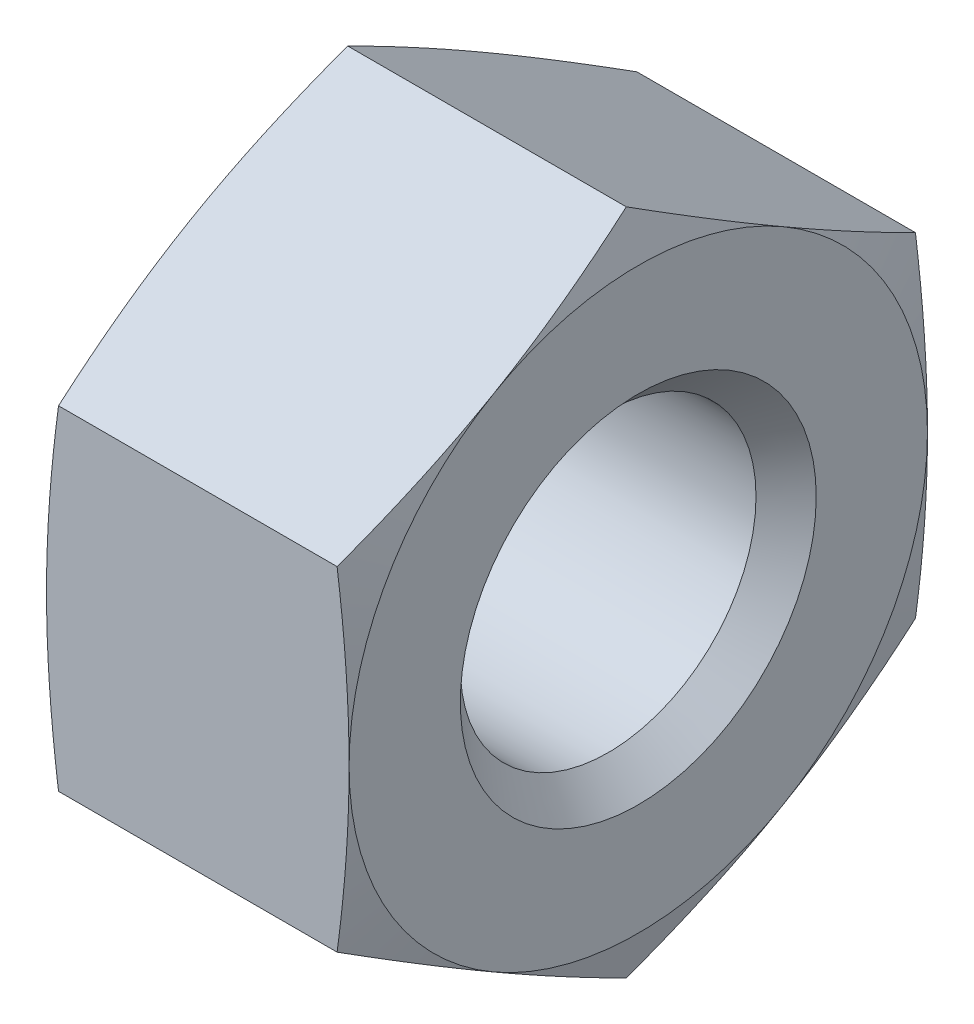
ISO-10303-21;
HEADER;
FILE_DESCRIPTION(('STEP AP214'),'2;1');
FILE_NAME('part.step','',(''),(''),'','','');
FILE_SCHEMA(('AUTOMOTIVE_DESIGN { 1 0 10303 214 1 1 1 1 }'));
ENDSEC;
DATA;
#1=APPLICATION_CONTEXT('core data for automotive mechanical design processes');
#2=APPLICATION_PROTOCOL_DEFINITION('international standard','automotive_design',2000,#1);
#3=PRODUCT_CONTEXT('',#1,'mechanical');
#4=PRODUCT('Part','Part','',(#3));
#5=PRODUCT_RELATED_PRODUCT_CATEGORY('part','',(#4));
#6=PRODUCT_DEFINITION_FORMATION('','',#4);
#7=PRODUCT_DEFINITION_CONTEXT('part definition',#1,'design');
#8=PRODUCT_DEFINITION('design','',#6,#7);
#9=PRODUCT_DEFINITION_SHAPE('','',#8);
#10=(LENGTH_UNIT() NAMED_UNIT(*) SI_UNIT(.MILLI.,.METRE.));
#11=(NAMED_UNIT(*) PLANE_ANGLE_UNIT() SI_UNIT($,.RADIAN.));
#12=(NAMED_UNIT(*) SI_UNIT($,.STERADIAN.) SOLID_ANGLE_UNIT());
#13=UNCERTAINTY_MEASURE_WITH_UNIT(LENGTH_MEASURE(1.E-05),#10,'distance_accuracy_value','');
#14=(GEOMETRIC_REPRESENTATION_CONTEXT(3) GLOBAL_UNCERTAINTY_ASSIGNED_CONTEXT((#13)) GLOBAL_UNIT_ASSIGNED_CONTEXT((#10,
#11,#12)) REPRESENTATION_CONTEXT('',''));
#15=CARTESIAN_POINT('',(0.,0.,0.));
#16=DIRECTION('',(0.,0.,1.));
#17=DIRECTION('',(1.,0.,0.));
#18=AXIS2_PLACEMENT_3D('',#15,#16,#17);
#19=CARTESIAN_POINT('',(3.39999999999999,0.,0.));
#20=DIRECTION('',(-1.,0.,0.));
#21=DIRECTION('',(0.,0.,1.));
#22=AXIS2_PLACEMENT_3D('',#19,#20,#21);
#23=CONICAL_SURFACE('',#22,19.1889727457342,1.30899693899575);
#24=CARTESIAN_POINT('',(5.34021947172718,-10.0251737628938,6.5));
#25=CARTESIAN_POINT('',(5.40678083004104,-9.72904060210872,6.5));
#26=CARTESIAN_POINT('',(5.47254405614128,-9.43272483546303,6.5));
#27=CARTESIAN_POINT('',(5.60204302842791,-8.83963813738695,6.5));
#28=CARTESIAN_POINT('',(5.66577868976473,-8.54286718745137,6.5));
#29=CARTESIAN_POINT('',(5.79084276931192,-7.94853361191854,6.5));
#30=CARTESIAN_POINT('',(5.85216893566304,-7.65097051080964,6.5));
#31=CARTESIAN_POINT('',(5.97176826112497,-7.05523170332754,6.5));
#32=CARTESIAN_POINT('',(6.03004144512884,-6.75705600196991,6.5));
#33=CARTESIAN_POINT('',(6.14231404260078,-6.16258492215604,6.5));
#34=CARTESIAN_POINT('',(6.19634623812122,-5.86629576492101,6.5));
#35=CARTESIAN_POINT('',(6.29980000329597,-5.27291497483705,6.5));
#36=CARTESIAN_POINT('',(6.34922167184055,-4.97582335934059,6.5));
#37=CARTESIAN_POINT('',(6.44236363249609,-4.3807637050931,6.5));
#38=CARTESIAN_POINT('',(6.48608436687417,-4.08279573616388,6.5));
#39=CARTESIAN_POINT('',(6.56655383876985,-3.48590898138837,6.5));
#40=CARTESIAN_POINT('',(6.60330256494201,-3.18699019399563,6.5));
#41=CARTESIAN_POINT('',(6.66881272585104,-2.584764246691,6.5));
#42=CARTESIAN_POINT('',(6.69747679536173,-2.28144633745983,6.5));
#43=CARTESIAN_POINT('',(6.74485048441128,-1.67402738577586,6.5));
#44=CARTESIAN_POINT('',(6.76356033446228,-1.36992636162173,6.5));
#45=CARTESIAN_POINT('',(6.78993598979016,-0.761394180131323,6.5));
#46=CARTESIAN_POINT('',(6.7976075268627,-0.456963276338684,6.5));
#47=CARTESIAN_POINT('',(6.80143396768605,0.151971860939782,6.5));
#48=CARTESIAN_POINT('',(6.7975888925574,0.456476094290104,6.5));
#49=CARTESIAN_POINT('',(6.77859056790397,1.06644588047543,6.5));
#50=CARTESIAN_POINT('',(6.76338836233449,1.37190987722144,6.5));
#51=CARTESIAN_POINT('',(6.72254386379028,1.9821326299433,6.5));
#52=CARTESIAN_POINT('',(6.69690133338368,2.28689136972182,6.5));
#53=CARTESIAN_POINT('',(6.63649559256864,2.89571025617504,6.5));
#54=CARTESIAN_POINT('',(6.60172585056413,3.19976974462881,6.5));
#55=CARTESIAN_POINT('',(6.52454313303007,3.80690394091179,6.5));
#56=CARTESIAN_POINT('',(6.48213017110956,4.10997865049346,6.5));
#57=CARTESIAN_POINT('',(6.3850484057838,4.75506655947626,6.5));
#58=CARTESIAN_POINT('',(6.32950103221924,5.09694645911478,6.5));
#59=CARTESIAN_POINT('',(6.21211981028681,5.77963160417396,6.5));
#60=CARTESIAN_POINT('',(6.15028565402791,6.12043679611797,6.5));
#61=CARTESIAN_POINT('',(6.02169857330525,6.80116950978304,6.5));
#62=CARTESIAN_POINT('',(5.95494485464203,7.14109688058279,6.5));
#63=CARTESIAN_POINT('',(5.81759232013227,7.82017640279045,6.5));
#64=CARTESIAN_POINT('',(5.74699343661706,8.15932854044599,6.5));
#65=CARTESIAN_POINT('',(5.60273764386895,8.83712554010565,6.5));
#66=CARTESIAN_POINT('',(5.52907948902662,9.17577013614967,6.5));
#67=CARTESIAN_POINT('',(5.37934752234481,9.85252567713227,6.5));
#68=CARTESIAN_POINT('',(5.30327369437395,10.1906366184914,6.5));
#69=CARTESIAN_POINT('',(5.07216770023523,11.2043244352433,6.5));
#70=CARTESIAN_POINT('',(4.91425365308442,11.8792441339056,6.5));
#71=CARTESIAN_POINT('',(4.67466611827668,12.8860888383443,6.5));
#72=CARTESIAN_POINT('',(4.59491764348655,13.2184762862448,6.5));
#73=CARTESIAN_POINT('',(4.43437664170439,13.8829947724658,6.5));
#74=CARTESIAN_POINT('',(4.3535841283887,14.2151258140848,6.5));
#75=CARTESIAN_POINT('',(4.10990177296983,15.211225435673,6.5));
#76=CARTESIAN_POINT('',(3.94571296506591,15.8748760485654,6.5));
#77=CARTESIAN_POINT('',(3.61515188527192,17.2004164720309,6.5));
#78=CARTESIAN_POINT('',(3.44878386547827,17.8623073457779,6.5));
#79=CARTESIAN_POINT('',(3.1141911912607,19.1855890197424,6.5));
#80=CARTESIAN_POINT('',(2.94596661870469,19.8469798406471,6.5));
#81=CARTESIAN_POINT('',(2.77710817478578,20.5082072209263,6.5));
#82=B_SPLINE_CURVE_WITH_KNOTS('',3,(#24,#25,#26,#27,#28,#29,#30,#31,#32,#33,#34,#35,#36,#37,#38,
#39,#40,#41,#42,#43,#44,#45,#46,#47,#48,#49,#50,#51,#52,#53,#54,#55,#56,#57,#58,#59,#60,#61,#62,
#63,#64,#65,#66,#67,#68,#69,#70,#71,#72,#73,#74,#75,#76,#77,#78,#79,#80,#81),.UNSPECIFIED.,.F.,
.F.,(4,2,2,2,2,2,2,2,2,2,2,2,2,2,2,2,2,2,2,2,2,2,2,2,2,2,2,2,4),(0.,0.910567903118991,
1.82117386170785,2.73261153485089,3.64404177526483,4.54753951194927,5.45101786523108,
6.3544260867088,7.2578357782774,8.17170128302531,9.08554562425924,9.99891526780276,
10.9122832363018,11.8296112516783,12.7469601299185,13.6649672775899,14.5829727907324,
15.6219850852705,16.6610482892823,17.7002796055642,18.7395292165465,19.779206196932,
20.8188901215308,22.8982953187992,23.9237562808119,24.9492038234374,27.0001743679401,
29.0476091835823,31.0949540719542),.UNSPECIFIED.);
#83=CARTESIAN_POINT('',(6.53056275187202,-3.75277674973257,6.5));
#84=VERTEX_POINT('',#83);
#85=CARTESIAN_POINT('',(6.8,0.,6.5));
#86=VERTEX_POINT('',#85);
#87=EDGE_CURVE('E542',#84,#86,#82,.T.);
#88=ORIENTED_EDGE('',*,*,#87,.F.);
#89=CARTESIAN_POINT('',(6.53053181105035,-7.50566896951898,-0.000199999999999112));
#90=CARTESIAN_POINT('',(6.57231021310497,-7.34981601048003,0.269745243565409));
#91=CARTESIAN_POINT('',(6.61023811897147,-7.19368047083108,0.540179931104566));
#92=CARTESIAN_POINT('',(6.67687390648081,-6.88085798289523,1.08200437395956));
#93=CARTESIAN_POINT('',(6.70557804307257,-6.72417083668118,1.35339447209528));
#94=CARTESIAN_POINT('',(6.75209055272491,-6.41119513752199,1.89548428457339));
#95=CARTESIAN_POINT('',(6.76995439432567,-6.25490870095099,2.16618033324825));
#96=CARTESIAN_POINT('',(6.7939079789398,-5.94213652150166,2.70791763924853));
#97=CARTESIAN_POINT('',(6.79999999999999,-5.78565082305026,2.97895881962427));
#98=CARTESIAN_POINT('',(6.79999999999999,-5.47267942614745,3.52104118037574));
#99=CARTESIAN_POINT('',(6.7939079789398,-5.31619372769604,3.79208236075147));
#100=CARTESIAN_POINT('',(6.76995439432568,-5.00342154824672,4.33381966675176));
#101=CARTESIAN_POINT('',(6.75209055272491,-4.84713511167572,4.60451571542661));
#102=CARTESIAN_POINT('',(6.70557804307257,-4.53415941251653,5.14660552790472));
#103=CARTESIAN_POINT('',(6.67687390648081,-4.37747226630247,5.41799562604044));
#104=CARTESIAN_POINT('',(6.61023811897147,-4.06464977836662,5.95982006889544));
#105=CARTESIAN_POINT('',(6.57231021310498,-3.90851423871768,6.23025475643459));
#106=CARTESIAN_POINT('',(6.53053181105035,-3.75266127967873,6.5002));
#107=B_SPLINE_CURVE_WITH_KNOTS('',3,(#89,#90,#91,#92,#93,#94,#95,#96,#97,#98,#99,#100,#101,#102,
#103,#104,#105,#106),.UNSPECIFIED.,.F.,.F.,(4,2,2,2,2,2,2,2,4),(0.,0.943529232034515,
1.88744107483688,2.82648138276556,3.76533995226988,4.70419852177419,5.64323882970288,
6.58715067250524,7.53067990453976),.UNSPECIFIED.);
#108=CARTESIAN_POINT('',(6.79999999999999,-5.62916512459885,3.25));
#109=VERTEX_POINT('',#108);
#110=EDGE_CURVE('E190',#109,#84,#107,.T.);
#111=ORIENTED_EDGE('',*,*,#110,.F.);
#112=CARTESIAN_POINT('',(6.79999999999999,0.,0.));
#113=DIRECTION('',(1.,0.,0.));
#114=DIRECTION('',(0.,0.,-1.));
#115=AXIS2_PLACEMENT_3D('',#112,#113,#114);
#116=CIRCLE('',#115,6.5);
#117=EDGE_CURVE('E570',#86,#109,#116,.T.);
#118=ORIENTED_EDGE('',*,*,#117,.F.);
#119=EDGE_LOOP('',(#88,#111,#118));
#120=FACE_BOUND('',#119,.T.);
#121=ADVANCED_FACE('F83',(#120),#23,.T.);
#122=CARTESIAN_POINT('',(6.53056275187202,3.75277674973257,6.5));
#123=VERTEX_POINT('',#122);
#124=EDGE_CURVE('E264',#86,#123,#82,.T.);
#125=ORIENTED_EDGE('',*,*,#124,.F.);
#126=CARTESIAN_POINT('',(6.79999999999999,5.62916512459885,3.25000000000001));
#127=VERTEX_POINT('',#126);
#128=EDGE_CURVE('E336',#127,#86,#116,.T.);
#129=ORIENTED_EDGE('',*,*,#128,.F.);
#130=CARTESIAN_POINT('',(6.53053181105036,3.75266127967873,6.5002));
#131=CARTESIAN_POINT('',(6.57231021310498,3.90851423871768,6.23025475643459));
#132=CARTESIAN_POINT('',(6.61023811897147,4.06464977836662,5.95982006889543));
#133=CARTESIAN_POINT('',(6.67687390648081,4.37747226630248,5.41799562604044));
#134=CARTESIAN_POINT('',(6.70557804307257,4.53415941251653,5.14660552790472));
#135=CARTESIAN_POINT('',(6.75209055272491,4.84713511167573,4.60451571542661));
#136=CARTESIAN_POINT('',(6.76995439432567,5.00342154824672,4.33381966675175));
#137=CARTESIAN_POINT('',(6.7939079789398,5.31619372769605,3.79208236075147));
#138=CARTESIAN_POINT('',(6.79999999999999,5.47267942614746,3.52104118037574));
#139=CARTESIAN_POINT('',(6.79999999999999,5.78565082305027,2.97895881962426));
#140=CARTESIAN_POINT('',(6.7939079789398,5.94213652150167,2.70791763924853));
#141=CARTESIAN_POINT('',(6.76995439432567,6.254908700951,2.16618033324825));
#142=CARTESIAN_POINT('',(6.75209055272491,6.41119513752199,1.89548428457339));
#143=CARTESIAN_POINT('',(6.70557804307257,6.72417083668119,1.35339447209528));
#144=CARTESIAN_POINT('',(6.6768739064808,6.88085798289524,1.08200437395956));
#145=CARTESIAN_POINT('',(6.61023811897147,7.1936804708311,0.540179931104566));
#146=CARTESIAN_POINT('',(6.57231021310497,7.34981601048004,0.269745243565409));
#147=CARTESIAN_POINT('',(6.53053181105035,7.50566896951899,-0.000199999999999644));
#148=B_SPLINE_CURVE_WITH_KNOTS('',3,(#130,#131,#132,#133,#134,#135,#136,#137,#138,#139,#140,
#141,#142,#143,#144,#145,#146,#147),.UNSPECIFIED.,.F.,.F.,(4,2,2,2,2,2,2,2,4),(0.,
0.943529232034517,1.88744107483688,2.82648138276556,3.76533995226988,4.7041985217742,
5.64323882970288,6.58715067250524,7.53067990453976),.UNSPECIFIED.);
#149=EDGE_CURVE('E262',#123,#127,#148,.T.);
#150=ORIENTED_EDGE('',*,*,#149,.F.);
#151=EDGE_LOOP('',(#125,#129,#150));
#152=FACE_BOUND('',#151,.T.);
#153=ADVANCED_FACE('F236',(#152),#23,.T.);
#154=CARTESIAN_POINT('',(6.53056275187202,7.50555349946515,0.));
#155=VERTEX_POINT('',#154);
#156=EDGE_CURVE('E257',#127,#155,#148,.T.);
#157=ORIENTED_EDGE('',*,*,#156,.F.);
#158=CARTESIAN_POINT('',(6.79999999999999,5.62916512459885,-3.25000000000002));
#159=VERTEX_POINT('',#158);
#160=EDGE_CURVE('E332',#159,#127,#116,.T.);
#161=ORIENTED_EDGE('',*,*,#160,.F.);
#162=CARTESIAN_POINT('',(6.53053181105035,7.50566896951899,0.000199999999999112));
#163=CARTESIAN_POINT('',(6.57231021310497,7.34981601048004,-0.269745243565409));
#164=CARTESIAN_POINT('',(6.61023811897147,7.1936804708311,-0.540179931104566));
#165=CARTESIAN_POINT('',(6.6768739064808,6.88085798289525,-1.08200437395956));
#166=CARTESIAN_POINT('',(6.70557804307257,6.72417083668119,-1.35339447209528));
#167=CARTESIAN_POINT('',(6.75209055272491,6.41119513752199,-1.89548428457339));
#168=CARTESIAN_POINT('',(6.76995439432567,6.254908700951,-2.16618033324825));
#169=CARTESIAN_POINT('',(6.7939079789398,5.94213652150167,-2.70791763924853));
#170=CARTESIAN_POINT('',(6.79999999999999,5.78565082305027,-2.97895881962427));
#171=CARTESIAN_POINT('',(6.79999999999999,5.47267942614746,-3.52104118037574));
#172=CARTESIAN_POINT('',(6.7939079789398,5.31619372769605,-3.79208236075147));
#173=CARTESIAN_POINT('',(6.76995439432567,5.00342154824672,-4.33381966675176));
#174=CARTESIAN_POINT('',(6.75209055272491,4.84713511167573,-4.60451571542661));
#175=CARTESIAN_POINT('',(6.70557804307257,4.53415941251653,-5.14660552790472));
#176=CARTESIAN_POINT('',(6.67687390648081,4.37747226630248,-5.41799562604044));
#177=CARTESIAN_POINT('',(6.61023811897147,4.06464977836662,-5.95982006889544));
#178=CARTESIAN_POINT('',(6.57231021310497,3.90851423871768,-6.23025475643459));
#179=CARTESIAN_POINT('',(6.53053181105035,3.75266127967873,-6.5002));
#180=B_SPLINE_CURVE_WITH_KNOTS('',3,(#162,#163,#164,#165,#166,#167,#168,#169,#170,#171,#172,
#173,#174,#175,#176,#177,#178,#179),.UNSPECIFIED.,.F.,.F.,(4,2,2,2,2,2,2,2,4),(0.,
0.943529232034517,1.88744107483688,2.82648138276556,3.76533995226988,4.7041985217742,
5.64323882970288,6.58715067250524,7.53067990453976),.UNSPECIFIED.);
#181=EDGE_CURVE('E263',#155,#159,#180,.T.);
#182=ORIENTED_EDGE('',*,*,#181,.F.);
#183=EDGE_LOOP('',(#157,#161,#182));
#184=FACE_BOUND('',#183,.T.);
#185=ADVANCED_FACE('F417',(#184),#23,.T.);
#186=CARTESIAN_POINT('',(6.53056275187202,3.75277674973257,-6.5));
#187=VERTEX_POINT('',#186);
#188=EDGE_CURVE('E252',#159,#187,#180,.T.);
#189=ORIENTED_EDGE('',*,*,#188,.F.);
#190=CARTESIAN_POINT('',(6.79999999999999,0.,-6.5));
#191=VERTEX_POINT('',#190);
#192=EDGE_CURVE('E323',#191,#159,#116,.T.);
#193=ORIENTED_EDGE('',*,*,#192,.F.);
#194=CARTESIAN_POINT('',(5.34021947172718,-10.0251737628938,-6.5));
#195=CARTESIAN_POINT('',(5.40678083004104,-9.72904060210872,-6.5));
#196=CARTESIAN_POINT('',(5.47254405614128,-9.43272483546303,-6.5));
#197=CARTESIAN_POINT('',(5.60204302842791,-8.83963813738695,-6.5));
#198=CARTESIAN_POINT('',(5.66577868976473,-8.54286718745137,-6.5));
#199=CARTESIAN_POINT('',(5.79084276931192,-7.94853361191854,-6.5));
#200=CARTESIAN_POINT('',(5.85216893566304,-7.65097051080964,-6.5));
#201=CARTESIAN_POINT('',(5.97176826112497,-7.05523170332754,-6.5));
#202=CARTESIAN_POINT('',(6.03004144512884,-6.75705600196991,-6.5));
#203=CARTESIAN_POINT('',(6.14231404260078,-6.16258492215604,-6.5));
#204=CARTESIAN_POINT('',(6.19634623812122,-5.86629576492101,-6.5));
#205=CARTESIAN_POINT('',(6.29980000329597,-5.27291497483705,-6.5));
#206=CARTESIAN_POINT('',(6.34922167184055,-4.97582335934059,-6.5));
#207=CARTESIAN_POINT('',(6.44236363249609,-4.3807637050931,-6.5));
#208=CARTESIAN_POINT('',(6.48608436687417,-4.08279573616388,-6.5));
#209=CARTESIAN_POINT('',(6.56655383876985,-3.48590898138837,-6.5));
#210=CARTESIAN_POINT('',(6.60330256494201,-3.18699019399563,-6.5));
#211=CARTESIAN_POINT('',(6.66881272585104,-2.584764246691,-6.5));
#212=CARTESIAN_POINT('',(6.69747679536173,-2.28144633745983,-6.5));
#213=CARTESIAN_POINT('',(6.74485048441128,-1.67402738577586,-6.5));
#214=CARTESIAN_POINT('',(6.76356033446228,-1.36992636162173,-6.5));
#215=CARTESIAN_POINT('',(6.78993598979016,-0.761394180131322,-6.5));
#216=CARTESIAN_POINT('',(6.7976075268627,-0.456963276338684,-6.5));
#217=CARTESIAN_POINT('',(6.80143396768605,0.151971860939783,-6.5));
#218=CARTESIAN_POINT('',(6.79758889255739,0.456476094290105,-6.5));
#219=CARTESIAN_POINT('',(6.77859056790397,1.06644588047543,-6.5));
#220=CARTESIAN_POINT('',(6.76338836233449,1.37190987722144,-6.5));
#221=CARTESIAN_POINT('',(6.72254386379028,1.9821326299433,-6.5));
#222=CARTESIAN_POINT('',(6.69690133338368,2.28689136972182,-6.5));
#223=CARTESIAN_POINT('',(6.63649559256864,2.89571025617504,-6.5));
#224=CARTESIAN_POINT('',(6.60172585056413,3.19976974462881,-6.5));
#225=CARTESIAN_POINT('',(6.52454313303007,3.8069039409118,-6.5));
#226=CARTESIAN_POINT('',(6.48213017110956,4.10997865049346,-6.5));
#227=CARTESIAN_POINT('',(6.3850484057838,4.75506655947626,-6.5));
#228=CARTESIAN_POINT('',(6.32950103221924,5.09694645911478,-6.5));
#229=CARTESIAN_POINT('',(6.21211981028681,5.77963160417396,-6.5));
#230=CARTESIAN_POINT('',(6.1502856540279,6.12043679611797,-6.5));
#231=CARTESIAN_POINT('',(6.02169857330525,6.80116950978304,-6.5));
#232=CARTESIAN_POINT('',(5.95494485464203,7.14109688058279,-6.5));
#233=CARTESIAN_POINT('',(5.81759232013227,7.82017640279045,-6.5));
#234=CARTESIAN_POINT('',(5.74699343661706,8.15932854044599,-6.5));
#235=CARTESIAN_POINT('',(5.60273764386895,8.83712554010565,-6.5));
#236=CARTESIAN_POINT('',(5.52907948902662,9.17577013614967,-6.5));
#237=CARTESIAN_POINT('',(5.3793475223448,9.85252567713227,-6.5));
#238=CARTESIAN_POINT('',(5.30327369437395,10.1906366184914,-6.5));
#239=CARTESIAN_POINT('',(5.07216770023522,11.2043244352433,-6.5));
#240=CARTESIAN_POINT('',(4.91425365308442,11.8792441339056,-6.5));
#241=CARTESIAN_POINT('',(4.67466611827667,12.8860888383443,-6.5));
#242=CARTESIAN_POINT('',(4.59491764348654,13.2184762862448,-6.5));
#243=CARTESIAN_POINT('',(4.43437664170439,13.8829947724658,-6.5));
#244=CARTESIAN_POINT('',(4.3535841283887,14.2151258140848,-6.5));
#245=CARTESIAN_POINT('',(4.10990177296983,15.211225435673,-6.5));
#246=CARTESIAN_POINT('',(3.9457129650659,15.8748760485654,-6.5));
#247=CARTESIAN_POINT('',(3.61515188527192,17.2004164720309,-6.5));
#248=CARTESIAN_POINT('',(3.44878386547827,17.8623073457779,-6.5));
#249=CARTESIAN_POINT('',(3.1141911912607,19.1855890197424,-6.5));
#250=CARTESIAN_POINT('',(2.94596661870469,19.8469798406471,-6.5));
#251=CARTESIAN_POINT('',(2.77710817478578,20.5082072209263,-6.5));
#252=B_SPLINE_CURVE_WITH_KNOTS('',3,(#194,#195,#196,#197,#198,#199,#200,#201,#202,#203,#204,
#205,#206,#207,#208,#209,#210,#211,#212,#213,#214,#215,#216,#217,#218,#219,#220,#221,#222,#223,
#224,#225,#226,#227,#228,#229,#230,#231,#232,#233,#234,#235,#236,#237,#238,#239,#240,#241,#242,
#243,#244,#245,#246,#247,#248,#249,#250,#251),.UNSPECIFIED.,.F.,.F.,(4,2,2,2,2,2,2,2,2,2,2,2,2,
2,2,2,2,2,2,2,2,2,2,2,2,2,2,2,4),(0.,0.910567903118991,1.82117386170785,2.73261153485089,
3.64404177526483,4.54753951194927,5.45101786523108,6.3544260867088,7.2578357782774,
8.17170128302531,9.08554562425924,9.99891526780277,10.9122832363018,11.8296112516783,
12.7469601299185,13.6649672775899,14.5829727907324,15.6219850852705,16.6610482892823,
17.7002796055642,18.7395292165465,19.779206196932,20.8188901215308,22.8982953187993,
23.9237562808119,24.9492038234374,27.0001743679401,29.0476091835823,31.0949540719542),.UNSPECIFIED.);
#253=EDGE_CURVE('E303',#187,#191,#252,.F.);
#254=ORIENTED_EDGE('',*,*,#253,.F.);
#255=EDGE_LOOP('',(#189,#193,#254));
#256=FACE_BOUND('',#255,.T.);
#257=ADVANCED_FACE('F329',(#256),#23,.T.);
#258=CARTESIAN_POINT('',(6.53056275187202,-3.75277674973257,-6.5));
#259=VERTEX_POINT('',#258);
#260=EDGE_CURVE('E247',#191,#259,#252,.F.);
#261=ORIENTED_EDGE('',*,*,#260,.F.);
#262=CARTESIAN_POINT('',(6.79999999999999,-5.62916512459885,-3.25));
#263=VERTEX_POINT('',#262);
#264=EDGE_CURVE('E317',#263,#191,#116,.T.);
#265=ORIENTED_EDGE('',*,*,#264,.F.);
#266=CARTESIAN_POINT('',(6.53053181105036,-3.75266127967873,-6.5002));
#267=CARTESIAN_POINT('',(6.57231021310498,-3.90851423871768,-6.23025475643459));
#268=CARTESIAN_POINT('',(6.61023811897147,-4.06464977836662,-5.95982006889543));
#269=CARTESIAN_POINT('',(6.67687390648081,-4.37747226630247,-5.41799562604044));
#270=CARTESIAN_POINT('',(6.70557804307257,-4.53415941251653,-5.14660552790472));
#271=CARTESIAN_POINT('',(6.75209055272491,-4.84713511167572,-4.60451571542661));
#272=CARTESIAN_POINT('',(6.76995439432567,-5.00342154824672,-4.33381966675175));
#273=CARTESIAN_POINT('',(6.7939079789398,-5.31619372769604,-3.79208236075147));
#274=CARTESIAN_POINT('',(6.79999999999999,-5.47267942614745,-3.52104118037574));
#275=CARTESIAN_POINT('',(6.79999999999999,-5.78565082305026,-2.97895881962426));
#276=CARTESIAN_POINT('',(6.7939079789398,-5.94213652150166,-2.70791763924853));
#277=CARTESIAN_POINT('',(6.76995439432568,-6.25490870095099,-2.16618033324825));
#278=CARTESIAN_POINT('',(6.75209055272491,-6.41119513752199,-1.89548428457339));
#279=CARTESIAN_POINT('',(6.70557804307257,-6.72417083668118,-1.35339447209528));
#280=CARTESIAN_POINT('',(6.67687390648081,-6.88085798289523,-1.08200437395956));
#281=CARTESIAN_POINT('',(6.61023811897147,-7.19368047083108,-0.540179931104564));
#282=CARTESIAN_POINT('',(6.57231021310498,-7.34981601048003,-0.269745243565407));
#283=CARTESIAN_POINT('',(6.53053181105035,-7.50566896951898,0.00020000000000043));
#284=B_SPLINE_CURVE_WITH_KNOTS('',3,(#266,#267,#268,#269,#270,#271,#272,#273,#274,#275,#276,
#277,#278,#279,#280,#281,#282,#283),.UNSPECIFIED.,.F.,.F.,(4,2,2,2,2,2,2,2,4),(0.,
0.943529232034516,1.88744107483688,2.82648138276556,3.76533995226988,4.70419852177419,
5.64323882970287,6.58715067250524,7.53067990453975),.UNSPECIFIED.);
#285=EDGE_CURVE('E319',#259,#263,#284,.T.);
#286=ORIENTED_EDGE('',*,*,#285,.F.);
#287=EDGE_LOOP('',(#261,#265,#286));
#288=FACE_BOUND('',#287,.T.);
#289=ADVANCED_FACE('F316',(#288),#23,.T.);
#290=CARTESIAN_POINT('',(6.53056275187202,-7.50555349946514,0.));
#291=VERTEX_POINT('',#290);
#292=EDGE_CURVE('E228',#263,#291,#284,.T.);
#293=ORIENTED_EDGE('',*,*,#292,.F.);
#294=EDGE_CURVE('E326',#109,#263,#116,.T.);
#295=ORIENTED_EDGE('',*,*,#294,.F.);
#296=EDGE_CURVE('E103',#291,#109,#107,.T.);
#297=ORIENTED_EDGE('',*,*,#296,.F.);
#298=EDGE_LOOP('',(#293,#295,#297));
#299=FACE_BOUND('',#298,.T.);
#300=ADVANCED_FACE('F238',(#299),#23,.T.);
#301=CARTESIAN_POINT('',(0.,0.,0.));
#302=DIRECTION('',(1.,0.,0.));
#303=DIRECTION('',(0.,0.,-1.));
#304=AXIS2_PLACEMENT_3D('',#301,#302,#303);
#305=CONICAL_SURFACE('',#304,6.5,1.30899693899575);
#306=CARTESIAN_POINT('',(0.269468188949638,3.75266127967873,-6.5002));
#307=CARTESIAN_POINT('',(0.227689786895018,3.90851423871768,-6.23025475643459));
#308=CARTESIAN_POINT('',(0.189761881028522,4.06464977836662,-5.95982006889543));
#309=CARTESIAN_POINT('',(0.123126093519188,4.37747226630248,-5.41799562604044));
#310=CARTESIAN_POINT('',(0.0944219569274201,4.53415941251653,-5.14660552790472));
#311=CARTESIAN_POINT('',(0.0479094472750833,4.84713511167573,-4.60451571542661));
#312=CARTESIAN_POINT('',(0.0300456056743197,5.00342154824672,-4.33381966675176));
#313=CARTESIAN_POINT('',(0.00609202106019569,5.31619372769605,-3.79208236075147));
#314=CARTESIAN_POINT('',(0.,5.47267942614746,-3.52104118037574));
#315=CARTESIAN_POINT('',(0.,5.78565082305027,-2.97895881962427));
#316=CARTESIAN_POINT('',(0.0060920210601966,5.94213652150167,-2.70791763924853));
#317=CARTESIAN_POINT('',(0.0300456056743214,6.254908700951,-2.16618033324825));
#318=CARTESIAN_POINT('',(0.0479094472750855,6.41119513752199,-1.89548428457339));
#319=CARTESIAN_POINT('',(0.0944219569274231,6.72417083668119,-1.35339447209528));
#320=CARTESIAN_POINT('',(0.123126093519191,6.88085798289524,-1.08200437395956));
#321=CARTESIAN_POINT('',(0.189761881028526,7.1936804708311,-0.540179931104568));
#322=CARTESIAN_POINT('',(0.227689786895022,7.34981601048004,-0.269745243565411));
#323=CARTESIAN_POINT('',(0.269468188949643,7.50566896951899,0.000199999999997151));
#324=B_SPLINE_CURVE_WITH_KNOTS('',3,(#306,#307,#308,#309,#310,#311,#312,#313,#314,#315,#316,
#317,#318,#319,#320,#321,#322,#323),.UNSPECIFIED.,.F.,.F.,(4,2,2,2,2,2,2,2,4),(0.,
0.943529232034517,1.88744107483688,2.82648138276556,3.76533995226988,4.70419852177419,
5.64323882970288,6.58715067250524,7.53067990453976),.UNSPECIFIED.);
#325=CARTESIAN_POINT('',(0.269437248127971,3.75277674973257,-6.5));
#326=VERTEX_POINT('',#325);
#327=CARTESIAN_POINT('',(0.,5.62916512459885,-3.25000000000002));
#328=VERTEX_POINT('',#327);
#329=EDGE_CURVE('E47',#326,#328,#324,.T.);
#330=ORIENTED_EDGE('',*,*,#329,.F.);
#331=CARTESIAN_POINT('',(1.45978052827281,-10.0251737628938,-6.5));
#332=CARTESIAN_POINT('',(1.39321916995895,-9.72904060210871,-6.5));
#333=CARTESIAN_POINT('',(1.32745594385871,-9.43272483546303,-6.5));
#334=CARTESIAN_POINT('',(1.19795697157208,-8.83963813738695,-6.5));
#335=CARTESIAN_POINT('',(1.13422131023526,-8.54286718745137,-6.5));
#336=CARTESIAN_POINT('',(1.00915723068807,-7.94853361191854,-6.5));
#337=CARTESIAN_POINT('',(0.947831064336954,-7.65097051080963,-6.5));
#338=CARTESIAN_POINT('',(0.828231738875019,-7.05523170332754,-6.5));
#339=CARTESIAN_POINT('',(0.769958554871155,-6.75705600196991,-6.5));
#340=CARTESIAN_POINT('',(0.657685957399216,-6.16258492215604,-6.5));
#341=CARTESIAN_POINT('',(0.603653761878771,-5.86629576492101,-6.5));
#342=CARTESIAN_POINT('',(0.500199996704026,-5.27291497483705,-6.5));
#343=CARTESIAN_POINT('',(0.450778328159441,-4.97582335934059,-6.5));
#344=CARTESIAN_POINT('',(0.3576363675039,-4.38076370509311,-6.5));
#345=CARTESIAN_POINT('',(0.313915633125826,-4.08279573616388,-6.5));
#346=CARTESIAN_POINT('',(0.23344616123014,-3.48590898138837,-6.5));
#347=CARTESIAN_POINT('',(0.196697435057979,-3.18699019399563,-6.5));
#348=CARTESIAN_POINT('',(0.131187274148952,-2.584764246691,-6.5));
#349=CARTESIAN_POINT('',(0.102523204638262,-2.28144633745983,-6.5));
#350=CARTESIAN_POINT('',(0.0551495155887146,-1.67402738577586,-6.5));
#351=CARTESIAN_POINT('',(0.0364396655377167,-1.36992636162173,-6.5));
#352=CARTESIAN_POINT('',(0.0100640102098355,-0.761394180131322,-6.5));
#353=CARTESIAN_POINT('',(0.00239247313729341,-0.456963276338683,-6.5));
#354=CARTESIAN_POINT('',(-0.00143396768606066,0.151971860939783,-6.5));
#355=CARTESIAN_POINT('',(0.00241110744259818,0.456476094290106,-6.5));
#356=CARTESIAN_POINT('',(0.0214094320960205,1.06644588047543,-6.5));
#357=CARTESIAN_POINT('',(0.0366116376655042,1.37190987722144,-6.5));
#358=CARTESIAN_POINT('',(0.0774561362097174,1.9821326299433,-6.5));
#359=CARTESIAN_POINT('',(0.103098666616318,2.28689136972182,-6.5));
#360=CARTESIAN_POINT('',(0.16350440743135,2.89571025617504,-6.5));
#361=CARTESIAN_POINT('',(0.198274149435865,3.19976974462881,-6.5));
#362=CARTESIAN_POINT('',(0.275456866969922,3.80690394091179,-6.5));
#363=CARTESIAN_POINT('',(0.317869828890433,4.10997865049346,-6.5));
#364=CARTESIAN_POINT('',(0.414951594216194,4.75506655947626,-6.5));
#365=CARTESIAN_POINT('',(0.470498967780748,5.09694645911478,-6.5));
#366=CARTESIAN_POINT('',(0.587880189713181,5.77963160417396,-6.5));
#367=CARTESIAN_POINT('',(0.649714345972086,6.12043679611797,-6.5));
#368=CARTESIAN_POINT('',(0.778301426694741,6.80116950978304,-6.5));
#369=CARTESIAN_POINT('',(0.845055145357959,7.14109688058279,-6.5));
#370=CARTESIAN_POINT('',(0.982407679867717,7.82017640279044,-6.5));
#371=CARTESIAN_POINT('',(1.05300656338293,8.15932854044598,-6.5));
#372=CARTESIAN_POINT('',(1.19726235613104,8.83712554010565,-6.5));
#373=CARTESIAN_POINT('',(1.27092051097337,9.17577013614967,-6.5));
#374=CARTESIAN_POINT('',(1.42065247765518,9.85252567713226,-6.5));
#375=CARTESIAN_POINT('',(1.49672630562604,10.1906366184914,-6.5));
#376=CARTESIAN_POINT('',(1.72783229976476,11.2043244352433,-6.5));
#377=CARTESIAN_POINT('',(1.88574634691557,11.8792441339056,-6.5));
#378=CARTESIAN_POINT('',(2.12533388172331,12.8860888383443,-6.5));
#379=CARTESIAN_POINT('',(2.20508235651344,13.2184762862448,-6.5));
#380=CARTESIAN_POINT('',(2.36562335829559,13.8829947724658,-6.5));
#381=CARTESIAN_POINT('',(2.44641587161128,14.2151258140848,-6.5));
#382=CARTESIAN_POINT('',(2.69009822703016,15.211225435673,-6.5));
#383=CARTESIAN_POINT('',(2.85428703493408,15.8748760485654,-6.5));
#384=CARTESIAN_POINT('',(3.18484811472807,17.2004164720309,-6.5));
#385=CARTESIAN_POINT('',(3.35121613452172,17.8623073457779,-6.5));
#386=CARTESIAN_POINT('',(3.68580880873928,19.1855890197424,-6.5));
#387=CARTESIAN_POINT('',(3.85403338129529,19.8469798406471,-6.5));
#388=CARTESIAN_POINT('',(4.0228918252142,20.5082072209263,-6.5));
#389=B_SPLINE_CURVE_WITH_KNOTS('',3,(#331,#332,#333,#334,#335,#336,#337,#338,#339,#340,#341,
#342,#343,#344,#345,#346,#347,#348,#349,#350,#351,#352,#353,#354,#355,#356,#357,#358,#359,#360,
#361,#362,#363,#364,#365,#366,#367,#368,#369,#370,#371,#372,#373,#374,#375,#376,#377,#378,#379,
#380,#381,#382,#383,#384,#385,#386,#387,#388),.UNSPECIFIED.,.F.,.F.,(4,2,2,2,2,2,2,2,2,2,2,2,2,
2,2,2,2,2,2,2,2,2,2,2,2,2,2,2,4),(0.,0.910567903118993,1.82117386170785,2.7326115348509,
3.64404177526483,4.54753951194927,5.45101786523108,6.3544260867088,7.2578357782774,
8.17170128302531,9.08554562425924,9.99891526780277,10.9122832363018,11.8296112516783,
12.7469601299185,13.6649672775899,14.5829727907324,15.6219850852705,16.6610482892823,
17.7002796055641,18.7395292165465,19.779206196932,20.8188901215308,22.8982953187992,
23.9237562808119,24.9492038234374,27.0001743679401,29.0476091835823,31.0949540719542),.UNSPECIFIED.);
#390=CARTESIAN_POINT('',(0.,0.,-6.5));
#391=VERTEX_POINT('',#390);
#392=EDGE_CURVE('E286',#391,#326,#389,.T.);
#393=ORIENTED_EDGE('',*,*,#392,.F.);
#394=CARTESIAN_POINT('',(0.,0.,0.));
#395=DIRECTION('',(1.,0.,0.));
#396=DIRECTION('',(0.,0.,-1.));
#397=AXIS2_PLACEMENT_3D('',#394,#395,#396);
#398=CIRCLE('',#397,6.5);
#399=EDGE_CURVE('E327',#391,#328,#398,.T.);
#400=ORIENTED_EDGE('',*,*,#399,.T.);
#401=EDGE_LOOP('',(#330,#393,#400));
#402=FACE_BOUND('',#401,.T.);
#403=ADVANCED_FACE('F210',(#402),#305,.T.);
#404=CARTESIAN_POINT('',(0.269437248127976,7.50555349946515,0.));
#405=VERTEX_POINT('',#404);
#406=EDGE_CURVE('E87',#328,#405,#324,.T.);
#407=ORIENTED_EDGE('',*,*,#406,.F.);
#408=CARTESIAN_POINT('',(0.,5.62916512459885,3.25000000000001));
#409=VERTEX_POINT('',#408);
#410=EDGE_CURVE('E543',#328,#409,#398,.T.);
#411=ORIENTED_EDGE('',*,*,#410,.T.);
#412=CARTESIAN_POINT('',(0.269468188949643,7.50566896951899,-0.000200000000000939));
#413=CARTESIAN_POINT('',(0.227689786895023,7.34981601048004,0.269745243565407));
#414=CARTESIAN_POINT('',(0.189761881028527,7.1936804708311,0.540179931104564));
#415=CARTESIAN_POINT('',(0.123126093519192,6.88085798289524,1.08200437395956));
#416=CARTESIAN_POINT('',(0.0944219569274233,6.72417083668119,1.35339447209528));
#417=CARTESIAN_POINT('',(0.0479094472750856,6.41119513752199,1.89548428457339));
#418=CARTESIAN_POINT('',(0.0300456056743215,6.254908700951,2.16618033324825));
#419=CARTESIAN_POINT('',(0.00609202106019685,5.94213652150167,2.70791763924853));
#420=CARTESIAN_POINT('',(0.,5.78565082305027,2.97895881962426));
#421=CARTESIAN_POINT('',(0.,5.47267942614746,3.52104118037574));
#422=CARTESIAN_POINT('',(0.00609202106019615,5.31619372769605,3.79208236075147));
#423=CARTESIAN_POINT('',(0.0300456056743201,5.00342154824672,4.33381966675176));
#424=CARTESIAN_POINT('',(0.0479094472750837,4.84713511167573,4.60451571542661));
#425=CARTESIAN_POINT('',(0.0944219569274207,4.53415941251653,5.14660552790472));
#426=CARTESIAN_POINT('',(0.123126093519189,4.37747226630248,5.41799562604044));
#427=CARTESIAN_POINT('',(0.189761881028523,4.06464977836662,5.95982006889544));
#428=CARTESIAN_POINT('',(0.227689786895019,3.90851423871768,6.23025475643459));
#429=CARTESIAN_POINT('',(0.269468188949639,3.75266127967873,6.5002));
#430=B_SPLINE_CURVE_WITH_KNOTS('',3,(#412,#413,#414,#415,#416,#417,#418,#419,#420,#421,#422,
#423,#424,#425,#426,#427,#428,#429),.UNSPECIFIED.,.F.,.F.,(4,2,2,2,2,2,2,2,4),(0.,
0.943529232034517,1.88744107483688,2.82648138276556,3.76533995226988,4.7041985217742,
5.64323882970288,6.58715067250524,7.53067990453976),.UNSPECIFIED.);
#431=EDGE_CURVE('E281',#405,#409,#430,.T.);
#432=ORIENTED_EDGE('',*,*,#431,.F.);
#433=EDGE_LOOP('',(#407,#411,#432));
#434=FACE_BOUND('',#433,.T.);
#435=ADVANCED_FACE('F451',(#434),#305,.T.);
#436=CARTESIAN_POINT('',(0.269437248127972,3.75277674973257,6.5));
#437=VERTEX_POINT('',#436);
#438=EDGE_CURVE('E276',#409,#437,#430,.T.);
#439=ORIENTED_EDGE('',*,*,#438,.F.);
#440=CARTESIAN_POINT('',(0.,0.,6.5));
#441=VERTEX_POINT('',#440);
#442=EDGE_CURVE('E547',#409,#441,#398,.T.);
#443=ORIENTED_EDGE('',*,*,#442,.T.);
#444=CARTESIAN_POINT('',(1.45978052827281,-10.0251737628938,6.5));
#445=CARTESIAN_POINT('',(1.39321916995895,-9.72904060210871,6.5));
#446=CARTESIAN_POINT('',(1.32745594385871,-9.43272483546303,6.5));
#447=CARTESIAN_POINT('',(1.19795697157208,-8.83963813738695,6.5));
#448=CARTESIAN_POINT('',(1.13422131023526,-8.54286718745137,6.5));
#449=CARTESIAN_POINT('',(1.00915723068807,-7.94853361191854,6.5));
#450=CARTESIAN_POINT('',(0.947831064336955,-7.65097051080963,6.5));
#451=CARTESIAN_POINT('',(0.828231738875019,-7.05523170332754,6.5));
#452=CARTESIAN_POINT('',(0.769958554871156,-6.75705600196991,6.5));
#453=CARTESIAN_POINT('',(0.657685957399217,-6.16258492215604,6.5));
#454=CARTESIAN_POINT('',(0.603653761878772,-5.86629576492101,6.5));
#455=CARTESIAN_POINT('',(0.500199996704026,-5.27291497483705,6.5));
#456=CARTESIAN_POINT('',(0.450778328159442,-4.97582335934059,6.5));
#457=CARTESIAN_POINT('',(0.357636367503901,-4.38076370509311,6.5));
#458=CARTESIAN_POINT('',(0.313915633125827,-4.08279573616388,6.5));
#459=CARTESIAN_POINT('',(0.233446161230141,-3.48590898138837,6.5));
#460=CARTESIAN_POINT('',(0.19669743505798,-3.18699019399563,6.5));
#461=CARTESIAN_POINT('',(0.131187274148952,-2.584764246691,6.5));
#462=CARTESIAN_POINT('',(0.102523204638263,-2.28144633745983,6.5));
#463=CARTESIAN_POINT('',(0.0551495155887154,-1.67402738577586,6.5));
#464=CARTESIAN_POINT('',(0.0364396655377174,-1.36992636162173,6.5));
#465=CARTESIAN_POINT('',(0.0100640102098363,-0.761394180131322,6.5));
#466=CARTESIAN_POINT('',(0.00239247313729421,-0.456963276338683,6.5));
#467=CARTESIAN_POINT('',(-0.00143396768605986,0.151971860939783,6.5));
#468=CARTESIAN_POINT('',(0.00241110744259897,0.456476094290106,6.5));
#469=CARTESIAN_POINT('',(0.0214094320960213,1.06644588047543,6.5));
#470=CARTESIAN_POINT('',(0.036611637665505,1.37190987722144,6.5));
#471=CARTESIAN_POINT('',(0.0774561362097182,1.9821326299433,6.5));
#472=CARTESIAN_POINT('',(0.103098666616318,2.28689136972182,6.5));
#473=CARTESIAN_POINT('',(0.163504407431351,2.89571025617504,6.5));
#474=CARTESIAN_POINT('',(0.198274149435866,3.19976974462881,6.5));
#475=CARTESIAN_POINT('',(0.275456866969923,3.80690394091179,6.5));
#476=CARTESIAN_POINT('',(0.317869828890434,4.10997865049346,6.5));
#477=CARTESIAN_POINT('',(0.414951594216194,4.75506655947626,6.5));
#478=CARTESIAN_POINT('',(0.470498967780749,5.09694645911478,6.5));
#479=CARTESIAN_POINT('',(0.587880189713182,5.77963160417396,6.5));
#480=CARTESIAN_POINT('',(0.649714345972087,6.12043679611797,6.5));
#481=CARTESIAN_POINT('',(0.778301426694742,6.80116950978304,6.5));
#482=CARTESIAN_POINT('',(0.84505514535796,7.14109688058279,6.5));
#483=CARTESIAN_POINT('',(0.982407679867718,7.82017640279044,6.5));
#484=CARTESIAN_POINT('',(1.05300656338293,8.15932854044598,6.5));
#485=CARTESIAN_POINT('',(1.19726235613104,8.83712554010565,6.5));
#486=CARTESIAN_POINT('',(1.27092051097337,9.17577013614967,6.5));
#487=CARTESIAN_POINT('',(1.42065247765518,9.85252567713226,6.5));
#488=CARTESIAN_POINT('',(1.49672630562604,10.1906366184914,6.5));
#489=CARTESIAN_POINT('',(1.72783229976477,11.2043244352433,6.5));
#490=CARTESIAN_POINT('',(1.88574634691557,11.8792441339056,6.5));
#491=CARTESIAN_POINT('',(2.12533388172331,12.8860888383443,6.5));
#492=CARTESIAN_POINT('',(2.20508235651344,13.2184762862448,6.5));
#493=CARTESIAN_POINT('',(2.3656233582956,13.8829947724658,6.5));
#494=CARTESIAN_POINT('',(2.44641587161128,14.2151258140848,6.5));
#495=CARTESIAN_POINT('',(2.69009822703016,15.211225435673,6.5));
#496=CARTESIAN_POINT('',(2.85428703493408,15.8748760485654,6.5));
#497=CARTESIAN_POINT('',(3.18484811472807,17.2004164720309,6.5));
#498=CARTESIAN_POINT('',(3.35121613452172,17.8623073457779,6.5));
#499=CARTESIAN_POINT('',(3.68580880873928,19.1855890197424,6.5));
#500=CARTESIAN_POINT('',(3.85403338129529,19.8469798406471,6.5));
#501=CARTESIAN_POINT('',(4.0228918252142,20.5082072209263,6.5));
#502=B_SPLINE_CURVE_WITH_KNOTS('',3,(#444,#445,#446,#447,#448,#449,#450,#451,#452,#453,#454,
#455,#456,#457,#458,#459,#460,#461,#462,#463,#464,#465,#466,#467,#468,#469,#470,#471,#472,#473,
#474,#475,#476,#477,#478,#479,#480,#481,#482,#483,#484,#485,#486,#487,#488,#489,#490,#491,#492,
#493,#494,#495,#496,#497,#498,#499,#500,#501),.UNSPECIFIED.,.F.,.F.,(4,2,2,2,2,2,2,2,2,2,2,2,2,
2,2,2,2,2,2,2,2,2,2,2,2,2,2,2,4),(0.,0.910567903118993,1.82117386170785,2.7326115348509,
3.64404177526483,4.54753951194927,5.45101786523108,6.3544260867088,7.2578357782774,
8.17170128302531,9.08554562425924,9.99891526780277,10.9122832363018,11.8296112516783,
12.7469601299185,13.6649672775899,14.5829727907324,15.6219850852705,16.6610482892823,
17.7002796055641,18.7395292165465,19.779206196932,20.8188901215308,22.8982953187992,
23.9237562808119,24.9492038234374,27.0001743679401,29.0476091835823,31.0949540719542),.UNSPECIFIED.);
#503=EDGE_CURVE('E183',#437,#441,#502,.F.);
#504=ORIENTED_EDGE('',*,*,#503,.F.);
#505=EDGE_LOOP('',(#439,#443,#504));
#506=FACE_BOUND('',#505,.T.);
#507=ADVANCED_FACE('F459',(#506),#305,.T.);
#508=CARTESIAN_POINT('',(0.269437248127971,-3.75277674973257,-6.5));
#509=VERTEX_POINT('',#508);
#510=EDGE_CURVE('E282',#509,#391,#389,.T.);
#511=ORIENTED_EDGE('',*,*,#510,.F.);
#512=CARTESIAN_POINT('',(0.269468188949639,-7.50566896951898,0.000200000000000946));
#513=CARTESIAN_POINT('',(0.227689786895019,-7.34981601048003,-0.269745243565407));
#514=CARTESIAN_POINT('',(0.189761881028523,-7.19368047083108,-0.540179931104564));
#515=CARTESIAN_POINT('',(0.123126093519188,-6.88085798289523,-1.08200437395956));
#516=CARTESIAN_POINT('',(0.0944219569274201,-6.72417083668118,-1.35339447209528));
#517=CARTESIAN_POINT('',(0.0479094472750828,-6.41119513752199,-1.89548428457339));
#518=CARTESIAN_POINT('',(0.0300456056743189,-6.25490870095099,-2.16618033324825));
#519=CARTESIAN_POINT('',(0.00609202106019431,-5.94213652150166,-2.70791763924853));
#520=CARTESIAN_POINT('',(0.,-5.78565082305026,-2.97895881962426));
#521=CARTESIAN_POINT('',(0.,-5.47267942614745,-3.52104118037574));
#522=CARTESIAN_POINT('',(0.00609202106019421,-5.31619372769604,-3.79208236075147));
#523=CARTESIAN_POINT('',(0.0300456056743185,-5.00342154824672,-4.33381966675175));
#524=CARTESIAN_POINT('',(0.0479094472750821,-4.84713511167572,-4.60451571542661));
#525=CARTESIAN_POINT('',(0.0944219569274191,-4.53415941251653,-5.14660552790472));
#526=CARTESIAN_POINT('',(0.123126093519187,-4.37747226630247,-5.41799562604044));
#527=CARTESIAN_POINT('',(0.189761881028522,-4.06464977836662,-5.95982006889544));
#528=CARTESIAN_POINT('',(0.227689786895018,-3.90851423871768,-6.23025475643459));
#529=CARTESIAN_POINT('',(0.269468188949638,-3.75266127967873,-6.5002));
#530=B_SPLINE_CURVE_WITH_KNOTS('',3,(#512,#513,#514,#515,#516,#517,#518,#519,#520,#521,#522,
#523,#524,#525,#526,#527,#528,#529),.UNSPECIFIED.,.F.,.F.,(4,2,2,2,2,2,2,2,4),(0.,
0.943529232034515,1.88744107483688,2.82648138276556,3.76533995226988,4.70419852177419,
5.64323882970288,6.58715067250524,7.53067990453976),.UNSPECIFIED.);
#531=CARTESIAN_POINT('',(0.,-5.62916512459885,-3.25));
#532=VERTEX_POINT('',#531);
#533=EDGE_CURVE('E198',#532,#509,#530,.T.);
#534=ORIENTED_EDGE('',*,*,#533,.F.);
#535=EDGE_CURVE('E538',#532,#391,#398,.T.);
#536=ORIENTED_EDGE('',*,*,#535,.T.);
#537=EDGE_LOOP('',(#511,#534,#536));
#538=FACE_BOUND('',#537,.T.);
#539=ADVANCED_FACE('F467',(#538),#305,.T.);
#540=CARTESIAN_POINT('',(0.269437248127972,-3.75277674973257,6.5));
#541=VERTEX_POINT('',#540);
#542=EDGE_CURVE('E177',#441,#541,#502,.F.);
#543=ORIENTED_EDGE('',*,*,#542,.F.);
#544=CARTESIAN_POINT('',(0.,-5.62916512459885,3.25));
#545=VERTEX_POINT('',#544);
#546=EDGE_CURVE('E194',#441,#545,#398,.T.);
#547=ORIENTED_EDGE('',*,*,#546,.T.);
#548=CARTESIAN_POINT('',(0.269468188949639,-3.75266127967873,6.5002));
#549=CARTESIAN_POINT('',(0.227689786895018,-3.90851423871768,6.23025475643459));
#550=CARTESIAN_POINT('',(0.189761881028523,-4.06464977836662,5.95982006889543));
#551=CARTESIAN_POINT('',(0.123126093519188,-4.37747226630248,5.41799562604044));
#552=CARTESIAN_POINT('',(0.0944219569274204,-4.53415941251653,5.14660552790472));
#553=CARTESIAN_POINT('',(0.0479094472750832,-4.84713511167572,4.60451571542661));
#554=CARTESIAN_POINT('',(0.0300456056743192,-5.00342154824672,4.33381966675176));
#555=CARTESIAN_POINT('',(0.00609202106019491,-5.31619372769604,3.79208236075147));
#556=CARTESIAN_POINT('',(0.,-5.47267942614745,3.52104118037574));
#557=CARTESIAN_POINT('',(0.,-5.78565082305026,2.97895881962426));
#558=CARTESIAN_POINT('',(0.00609202106019486,-5.94213652150166,2.70791763924853));
#559=CARTESIAN_POINT('',(0.0300456056743193,-6.25490870095099,2.16618033324825));
#560=CARTESIAN_POINT('',(0.0479094472750835,-6.41119513752199,1.89548428457339));
#561=CARTESIAN_POINT('',(0.0944219569274208,-6.72417083668118,1.35339447209528));
#562=CARTESIAN_POINT('',(0.123126093519189,-6.88085798289523,1.08200437395956));
#563=CARTESIAN_POINT('',(0.189761881028523,-7.19368047083108,0.540179931104565));
#564=CARTESIAN_POINT('',(0.227689786895019,-7.34981601048003,0.269745243565408));
#565=CARTESIAN_POINT('',(0.269468188949639,-7.50566896951898,-0.000199999999999493));
#566=B_SPLINE_CURVE_WITH_KNOTS('',3,(#548,#549,#550,#551,#552,#553,#554,#555,#556,#557,#558,
#559,#560,#561,#562,#563,#564,#565),.UNSPECIFIED.,.F.,.F.,(4,2,2,2,2,2,2,2,4),(0.,
0.943529232034516,1.88744107483688,2.82648138276556,3.76533995226988,4.70419852177419,
5.64323882970287,6.58715067250524,7.53067990453975),.UNSPECIFIED.);
#567=EDGE_CURVE('E110',#541,#545,#566,.T.);
#568=ORIENTED_EDGE('',*,*,#567,.F.);
#569=EDGE_LOOP('',(#543,#547,#568));
#570=FACE_BOUND('',#569,.T.);
#571=ADVANCED_FACE('F193',(#570),#305,.T.);
#572=CARTESIAN_POINT('',(0.269437248127972,-7.50555349946514,0.));
#573=VERTEX_POINT('',#572);
#574=EDGE_CURVE('E187',#573,#532,#530,.T.);
#575=ORIENTED_EDGE('',*,*,#574,.F.);
#576=EDGE_CURVE('E195',#545,#573,#566,.T.);
#577=ORIENTED_EDGE('',*,*,#576,.F.);
#578=EDGE_CURVE('E532',#545,#532,#398,.T.);
#579=ORIENTED_EDGE('',*,*,#578,.T.);
#580=EDGE_LOOP('',(#575,#577,#579));
#581=FACE_BOUND('',#580,.T.);
#582=ADVANCED_FACE('F357',(#581),#305,.T.);
#583=CARTESIAN_POINT('',(0.,0.,4.));
#584=DIRECTION('',(1.,0.,0.));
#585=DIRECTION('',(0.,0.,-1.));
#586=AXIS2_PLACEMENT_3D('',#583,#584,#585);
#587=PLANE('',#586);
#588=ORIENTED_EDGE('',*,*,#399,.F.);
#589=ORIENTED_EDGE('',*,*,#535,.F.);
#590=ORIENTED_EDGE('',*,*,#578,.F.);
#591=ORIENTED_EDGE('',*,*,#546,.F.);
#592=ORIENTED_EDGE('',*,*,#442,.F.);
#593=ORIENTED_EDGE('',*,*,#410,.F.);
#594=EDGE_LOOP('',(#588,#589,#590,#591,#592,#593));
#595=FACE_BOUND('',#594,.T.);
#596=CARTESIAN_POINT('',(0.,0.,0.));
#597=DIRECTION('',(1.,0.,0.));
#598=DIRECTION('',(0.,0.,-1.));
#599=AXIS2_PLACEMENT_3D('',#596,#597,#598);
#600=CIRCLE('',#599,4.);
#601=CARTESIAN_POINT('',(0.,0.,-4.));
#602=VERTEX_POINT('',#601);
#603=EDGE_CURVE('E199',#602,#602,#600,.T.);
#604=ORIENTED_EDGE('',*,*,#603,.T.);
#605=EDGE_LOOP('',(#604));
#606=FACE_BOUND('',#605,.T.);
#607=ADVANCED_FACE('F85',(#595,#606),#587,.F.);
#608=CARTESIAN_POINT('',(0.676499999999994,0.,0.));
#609=DIRECTION('',(-1.,0.,0.));
#610=DIRECTION('',(0.,0.,1.));
#611=AXIS2_PLACEMENT_3D('',#608,#609,#610);
#612=CONICAL_SURFACE('',#611,3.3235,0.785398163397452);
#613=ORIENTED_EDGE('',*,*,#603,.F.);
#614=EDGE_LOOP('',(#613));
#615=FACE_BOUND('',#614,.T.);
#616=CARTESIAN_POINT('',(0.676499999999994,0.,0.));
#617=DIRECTION('',(1.,0.,0.));
#618=DIRECTION('',(0.,0.,-1.));
#619=AXIS2_PLACEMENT_3D('',#616,#617,#618);
#620=CIRCLE('',#619,3.3235);
#621=CARTESIAN_POINT('',(0.676499999999994,0.,-3.3235));
#622=VERTEX_POINT('',#621);
#623=EDGE_CURVE('E339',#622,#622,#620,.T.);
#624=ORIENTED_EDGE('',*,*,#623,.T.);
#625=EDGE_LOOP('',(#624));
#626=FACE_BOUND('',#625,.T.);
#627=ADVANCED_FACE('F347',(#615,#626),#612,.F.);
#628=CARTESIAN_POINT('',(0.,0.,0.));
#629=DIRECTION('',(1.,0.,0.));
#630=DIRECTION('',(0.,0.,-1.));
#631=AXIS2_PLACEMENT_3D('',#628,#629,#630);
#632=CYLINDRICAL_SURFACE('',#631,3.3235);
#633=ORIENTED_EDGE('',*,*,#623,.F.);
#634=EDGE_LOOP('',(#633));
#635=FACE_BOUND('',#634,.T.);
#636=CARTESIAN_POINT('',(6.1235,0.,0.));
#637=DIRECTION('',(1.,0.,0.));
#638=DIRECTION('',(0.,0.,-1.));
#639=AXIS2_PLACEMENT_3D('',#636,#637,#638);
#640=CIRCLE('',#639,3.3235);
#641=CARTESIAN_POINT('',(6.1235,0.,-3.3235));
#642=VERTEX_POINT('',#641);
#643=EDGE_CURVE('E334',#642,#642,#640,.T.);
#644=ORIENTED_EDGE('',*,*,#643,.T.);
#645=EDGE_LOOP('',(#644));
#646=FACE_BOUND('',#645,.T.);
#647=ADVANCED_FACE('F349',(#635,#646),#632,.F.);
#648=CARTESIAN_POINT('',(6.79999999999999,0.,0.));
#649=DIRECTION('',(1.,0.,0.));
#650=DIRECTION('',(0.,0.,-1.));
#651=AXIS2_PLACEMENT_3D('',#648,#649,#650);
#652=CONICAL_SURFACE('',#651,4.,0.785398163397452);
#653=ORIENTED_EDGE('',*,*,#643,.F.);
#654=EDGE_LOOP('',(#653));
#655=FACE_BOUND('',#654,.T.);
#656=CARTESIAN_POINT('',(6.79999999999999,0.,0.));
#657=DIRECTION('',(1.,0.,0.));
#658=DIRECTION('',(0.,0.,-1.));
#659=AXIS2_PLACEMENT_3D('',#656,#657,#658);
#660=CIRCLE('',#659,4.);
#661=CARTESIAN_POINT('',(6.79999999999999,0.,-4.));
#662=VERTEX_POINT('',#661);
#663=EDGE_CURVE('E331',#662,#662,#660,.T.);
#664=ORIENTED_EDGE('',*,*,#663,.T.);
#665=EDGE_LOOP('',(#664));
#666=FACE_BOUND('',#665,.T.);
#667=ADVANCED_FACE('F354',(#655,#666),#652,.F.);
#668=CARTESIAN_POINT('',(6.79999999999999,0.,6.5));
#669=DIRECTION('',(-1.,0.,0.));
#670=DIRECTION('',(0.,0.,1.));
#671=AXIS2_PLACEMENT_3D('',#668,#669,#670);
#672=PLANE('',#671);
#673=ORIENTED_EDGE('',*,*,#663,.F.);
#674=EDGE_LOOP('',(#673));
#675=FACE_BOUND('',#674,.T.);
#676=ORIENTED_EDGE('',*,*,#192,.T.);
#677=ORIENTED_EDGE('',*,*,#160,.T.);
#678=ORIENTED_EDGE('',*,*,#128,.T.);
#679=ORIENTED_EDGE('',*,*,#117,.T.);
#680=ORIENTED_EDGE('',*,*,#294,.T.);
#681=ORIENTED_EDGE('',*,*,#264,.T.);
#682=EDGE_LOOP('',(#676,#677,#678,#679,#680,#681));
#683=FACE_BOUND('',#682,.T.);
#684=ADVANCED_FACE('F239',(#675,#683),#672,.F.);
#685=CARTESIAN_POINT('',(-7.8,3.75277674973257,6.5));
#686=DIRECTION('',(0.,0.,1.));
#687=DIRECTION('',(1.,0.,0.));
#688=AXIS2_PLACEMENT_3D('',#685,#686,#687);
#689=PLANE('',#688);
#690=ORIENTED_EDGE('',*,*,#87,.T.);
#691=ORIENTED_EDGE('',*,*,#124,.T.);
#692=DIRECTION('',(1.,0.,0.));
#693=VECTOR('',#692,1.);
#694=CARTESIAN_POINT('',(-7.8,3.75277674973257,6.5));
#695=LINE('',#694,#693);
#696=EDGE_CURVE('E226',#437,#123,#695,.T.);
#697=ORIENTED_EDGE('',*,*,#696,.F.);
#698=ORIENTED_EDGE('',*,*,#503,.T.);
#699=ORIENTED_EDGE('',*,*,#542,.T.);
#700=DIRECTION('',(1.,0.,0.));
#701=VECTOR('',#700,1.);
#702=CARTESIAN_POINT('',(-7.8,-3.75277674973257,6.5));
#703=LINE('',#702,#701);
#704=EDGE_CURVE('E179',#541,#84,#703,.T.);
#705=ORIENTED_EDGE('',*,*,#704,.T.);
#706=EDGE_LOOP('',(#690,#691,#697,#698,#699,#705));
#707=FACE_BOUND('',#706,.T.);
#708=ADVANCED_FACE('F178',(#707),#689,.T.);
#709=CARTESIAN_POINT('',(-7.8,7.50555349946515,0.));
#710=DIRECTION('',(0.,0.866025403784438,0.500000000000002));
#711=DIRECTION('',(0.,-0.500000000000002,0.866025403784438));
#712=AXIS2_PLACEMENT_3D('',#709,#710,#711);
#713=PLANE('',#712);
#714=ORIENTED_EDGE('',*,*,#149,.T.);
#715=ORIENTED_EDGE('',*,*,#156,.T.);
#716=DIRECTION('',(1.,0.,0.));
#717=VECTOR('',#716,1.);
#718=CARTESIAN_POINT('',(-7.8,7.50555349946515,0.));
#719=LINE('',#718,#717);
#720=EDGE_CURVE('E557',#405,#155,#719,.T.);
#721=ORIENTED_EDGE('',*,*,#720,.F.);
#722=ORIENTED_EDGE('',*,*,#431,.T.);
#723=ORIENTED_EDGE('',*,*,#438,.T.);
#724=ORIENTED_EDGE('',*,*,#696,.T.);
#725=EDGE_LOOP('',(#714,#715,#721,#722,#723,#724));
#726=FACE_BOUND('',#725,.T.);
#727=ADVANCED_FACE('F269',(#726),#713,.T.);
#728=CARTESIAN_POINT('',(-7.8,3.75277674973257,-6.5));
#729=DIRECTION('',(0.,0.866025403784438,-0.500000000000002));
#730=DIRECTION('',(0.,0.500000000000002,0.866025403784438));
#731=AXIS2_PLACEMENT_3D('',#728,#729,#730);
#732=PLANE('',#731);
#733=ORIENTED_EDGE('',*,*,#181,.T.);
#734=ORIENTED_EDGE('',*,*,#188,.T.);
#735=DIRECTION('',(1.,0.,0.));
#736=VECTOR('',#735,1.);
#737=CARTESIAN_POINT('',(-7.8,3.75277674973257,-6.5));
#738=LINE('',#737,#736);
#739=EDGE_CURVE('E308',#326,#187,#738,.T.);
#740=ORIENTED_EDGE('',*,*,#739,.F.);
#741=ORIENTED_EDGE('',*,*,#329,.T.);
#742=ORIENTED_EDGE('',*,*,#406,.T.);
#743=ORIENTED_EDGE('',*,*,#720,.T.);
#744=EDGE_LOOP('',(#733,#734,#740,#741,#742,#743));
#745=FACE_BOUND('',#744,.T.);
#746=ADVANCED_FACE('F272',(#745),#732,.T.);
#747=CARTESIAN_POINT('',(-7.8,-3.75277674973257,-6.5));
#748=DIRECTION('',(0.,0.,-1.));
#749=DIRECTION('',(-1.,0.,0.));
#750=AXIS2_PLACEMENT_3D('',#747,#748,#749);
#751=PLANE('',#750);
#752=ORIENTED_EDGE('',*,*,#253,.T.);
#753=ORIENTED_EDGE('',*,*,#260,.T.);
#754=DIRECTION('',(1.,0.,0.));
#755=VECTOR('',#754,1.);
#756=CARTESIAN_POINT('',(-7.8,-3.75277674973257,-6.5));
#757=LINE('',#756,#755);
#758=EDGE_CURVE('E563',#509,#259,#757,.T.);
#759=ORIENTED_EDGE('',*,*,#758,.F.);
#760=ORIENTED_EDGE('',*,*,#510,.T.);
#761=ORIENTED_EDGE('',*,*,#392,.T.);
#762=ORIENTED_EDGE('',*,*,#739,.T.);
#763=EDGE_LOOP('',(#752,#753,#759,#760,#761,#762));
#764=FACE_BOUND('',#763,.T.);
#765=ADVANCED_FACE('F290',(#764),#751,.T.);
#766=CARTESIAN_POINT('',(-7.8,-7.50555349946514,0.));
#767=DIRECTION('',(0.,-0.866025403784439,-0.5));
#768=DIRECTION('',(0.,0.5,-0.866025403784439));
#769=AXIS2_PLACEMENT_3D('',#766,#767,#768);
#770=PLANE('',#769);
#771=ORIENTED_EDGE('',*,*,#285,.T.);
#772=ORIENTED_EDGE('',*,*,#292,.T.);
#773=DIRECTION('',(1.,0.,0.));
#774=VECTOR('',#773,1.);
#775=CARTESIAN_POINT('',(-7.8,-7.50555349946514,0.));
#776=LINE('',#775,#774);
#777=EDGE_CURVE('E191',#573,#291,#776,.T.);
#778=ORIENTED_EDGE('',*,*,#777,.F.);
#779=ORIENTED_EDGE('',*,*,#574,.T.);
#780=ORIENTED_EDGE('',*,*,#533,.T.);
#781=ORIENTED_EDGE('',*,*,#758,.T.);
#782=EDGE_LOOP('',(#771,#772,#778,#779,#780,#781));
#783=FACE_BOUND('',#782,.T.);
#784=ADVANCED_FACE('F216',(#783),#770,.T.);
#785=CARTESIAN_POINT('',(-7.8,-3.75277674973257,6.5));
#786=DIRECTION('',(0.,-0.866025403784439,0.5));
#787=DIRECTION('',(0.,-0.5,-0.866025403784439));
#788=AXIS2_PLACEMENT_3D('',#785,#786,#787);
#789=PLANE('',#788);
#790=ORIENTED_EDGE('',*,*,#296,.T.);
#791=ORIENTED_EDGE('',*,*,#110,.T.);
#792=ORIENTED_EDGE('',*,*,#704,.F.);
#793=ORIENTED_EDGE('',*,*,#567,.T.);
#794=ORIENTED_EDGE('',*,*,#576,.T.);
#795=ORIENTED_EDGE('',*,*,#777,.T.);
#796=EDGE_LOOP('',(#790,#791,#792,#793,#794,#795));
#797=FACE_BOUND('',#796,.T.);
#798=ADVANCED_FACE('F189',(#797),#789,.T.);
#799=CLOSED_SHELL('',(#121,#153,#185,#257,#289,#300,#403,#435,#507,#539,#571,#582,#607,#627,
#647,#667,#684,#708,#727,#746,#765,#784,#798));
#800=MANIFOLD_SOLID_BREP('B6',#799);
#801=ADVANCED_BREP_SHAPE_REPRESENTATION('',(#18,#800),#14);
#802=SHAPE_DEFINITION_REPRESENTATION(#9,#801);
ENDSEC;
END-ISO-10303-21;
